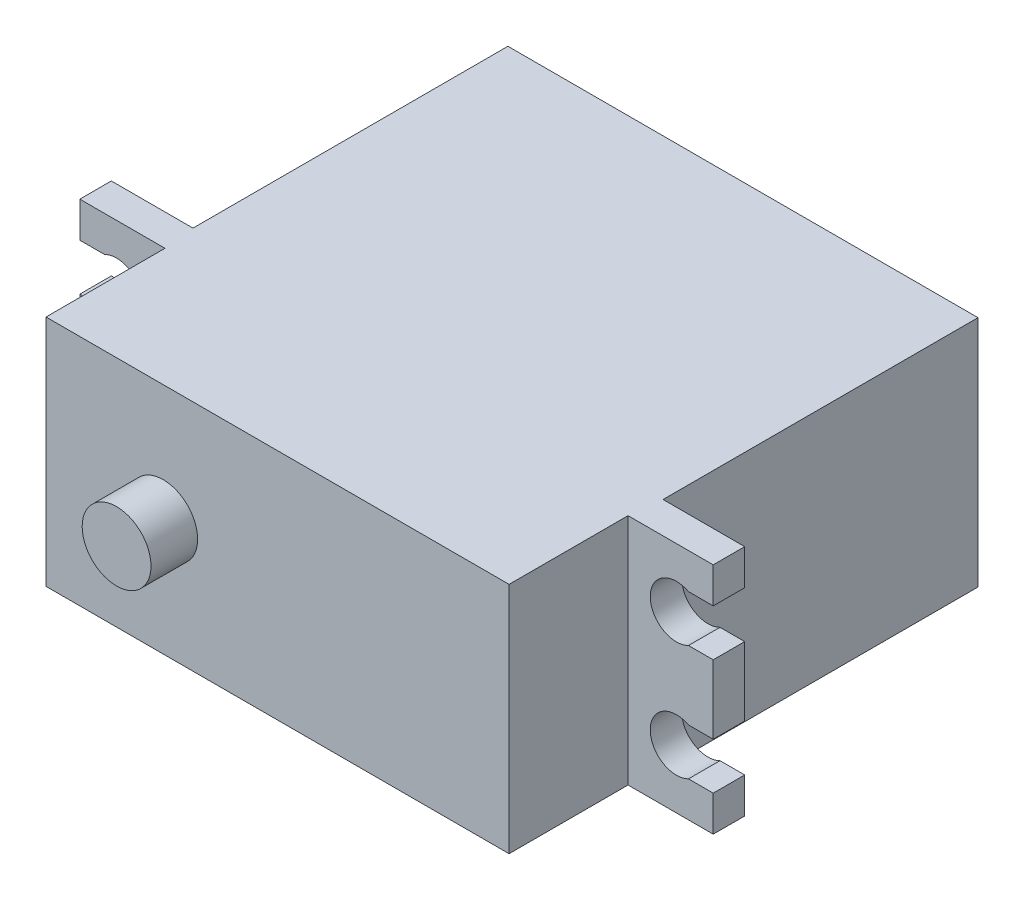
ISO-10303-21;
HEADER;
FILE_DESCRIPTION(('STEP AP214'),'2;1');
FILE_NAME('part.step','',(''),(''),'','','');
FILE_SCHEMA(('AUTOMOTIVE_DESIGN { 1 0 10303 214 1 1 1 1 }'));
ENDSEC;
DATA;
#1=APPLICATION_CONTEXT('core data for automotive mechanical design processes');
#2=APPLICATION_PROTOCOL_DEFINITION('international standard','automotive_design',2000,#1);
#3=PRODUCT_CONTEXT('',#1,'mechanical');
#4=PRODUCT('Part','Part','',(#3));
#5=PRODUCT_RELATED_PRODUCT_CATEGORY('part','',(#4));
#6=PRODUCT_DEFINITION_FORMATION('','',#4);
#7=PRODUCT_DEFINITION_CONTEXT('part definition',#1,'design');
#8=PRODUCT_DEFINITION('design','',#6,#7);
#9=PRODUCT_DEFINITION_SHAPE('','',#8);
#10=(LENGTH_UNIT() NAMED_UNIT(*) SI_UNIT(.MILLI.,.METRE.));
#11=(NAMED_UNIT(*) PLANE_ANGLE_UNIT() SI_UNIT($,.RADIAN.));
#12=(NAMED_UNIT(*) SI_UNIT($,.STERADIAN.) SOLID_ANGLE_UNIT());
#13=UNCERTAINTY_MEASURE_WITH_UNIT(LENGTH_MEASURE(1.E-05),#10,'distance_accuracy_value','');
#14=(GEOMETRIC_REPRESENTATION_CONTEXT(3) GLOBAL_UNCERTAINTY_ASSIGNED_CONTEXT((#13)) GLOBAL_UNIT_ASSIGNED_CONTEXT((#10,
#11,#12)) REPRESENTATION_CONTEXT('',''));
#15=CARTESIAN_POINT('',(0.,0.,0.));
#16=DIRECTION('',(0.,0.,1.));
#17=DIRECTION('',(1.,0.,0.));
#18=AXIS2_PLACEMENT_3D('',#15,#16,#17);
#19=CARTESIAN_POINT('',(-20.15,20.,13.5));
#20=DIRECTION('',(1.,0.,0.));
#21=DIRECTION('',(0.,0.,-1.));
#22=AXIS2_PLACEMENT_3D('',#19,#20,#21);
#23=PLANE('',#22);
#24=DIRECTION('',(0.,0.,1.));
#25=VECTOR('',#24,1.);
#26=CARTESIAN_POINT('',(-20.15,0.,13.5));
#27=LINE('',#26,#25);
#28=CARTESIAN_POINT('',(-20.15,0.,-13.5));
#29=VERTEX_POINT('',#28);
#30=CARTESIAN_POINT('',(-20.15,0.,13.5));
#31=VERTEX_POINT('',#30);
#32=EDGE_CURVE('E540',#29,#31,#27,.T.);
#33=ORIENTED_EDGE('',*,*,#32,.T.);
#34=DIRECTION('',(0.,-1.,0.));
#35=VECTOR('',#34,1.);
#36=CARTESIAN_POINT('',(-20.15,20.,13.5));
#37=LINE('',#36,#35);
#38=CARTESIAN_POINT('',(-20.15,20.,13.5));
#39=VERTEX_POINT('',#38);
#40=EDGE_CURVE('E52',#39,#31,#37,.T.);
#41=ORIENTED_EDGE('',*,*,#40,.F.);
#42=DIRECTION('',(0.,0.,1.));
#43=VECTOR('',#42,1.);
#44=CARTESIAN_POINT('',(-20.15,20.,13.5));
#45=LINE('',#44,#43);
#46=CARTESIAN_POINT('',(-20.15,20.,-13.5));
#47=VERTEX_POINT('',#46);
#48=EDGE_CURVE('E541',#47,#39,#45,.T.);
#49=ORIENTED_EDGE('',*,*,#48,.F.);
#50=DIRECTION('',(0.,-1.,0.));
#51=VECTOR('',#50,1.);
#52=CARTESIAN_POINT('',(-20.15,20.,-13.5));
#53=LINE('',#52,#51);
#54=EDGE_CURVE('E551',#47,#29,#53,.T.);
#55=ORIENTED_EDGE('',*,*,#54,.T.);
#56=EDGE_LOOP('',(#33,#41,#49,#55));
#57=FACE_BOUND('',#56,.T.);
#58=DIRECTION('',(0.,-1.,0.));
#59=VECTOR('',#58,1.);
#60=CARTESIAN_POINT('',(-20.15,4.31028668779854,-10.4184509071389));
#61=LINE('',#60,#59);
#62=CARTESIAN_POINT('',(-20.15,15.6897133122015,-10.4184509071389));
#63=VERTEX_POINT('',#62);
#64=CARTESIAN_POINT('',(-20.15,4.31028668779854,-10.4184509071389));
#65=VERTEX_POINT('',#64);
#66=EDGE_CURVE('E275',#63,#65,#61,.T.);
#67=ORIENTED_EDGE('',*,*,#66,.F.);
#68=DIRECTION('',(0.,0.,-1.));
#69=VECTOR('',#68,1.);
#70=CARTESIAN_POINT('',(-20.15,15.6897133122015,-6.91708886886109));
#71=LINE('',#70,#69);
#72=CARTESIAN_POINT('',(-20.15,15.6897133122015,-6.91708886886109));
#73=VERTEX_POINT('',#72);
#74=EDGE_CURVE('E272',#73,#63,#71,.T.);
#75=ORIENTED_EDGE('',*,*,#74,.F.);
#76=DIRECTION('',(0.,1.,0.));
#77=VECTOR('',#76,1.);
#78=CARTESIAN_POINT('',(-20.15,4.31028668779854,-6.91708886886109));
#79=LINE('',#78,#77);
#80=CARTESIAN_POINT('',(-20.15,4.31028668779854,-6.91708886886109));
#81=VERTEX_POINT('',#80);
#82=EDGE_CURVE('E64',#81,#73,#79,.T.);
#83=ORIENTED_EDGE('',*,*,#82,.F.);
#84=DIRECTION('',(0.,0.,1.));
#85=VECTOR('',#84,1.);
#86=CARTESIAN_POINT('',(-20.15,4.31028668779854,-6.91708886886109));
#87=LINE('',#86,#85);
#88=EDGE_CURVE('E59',#65,#81,#87,.T.);
#89=ORIENTED_EDGE('',*,*,#88,.F.);
#90=EDGE_LOOP('',(#67,#75,#83,#89));
#91=FACE_BOUND('',#90,.T.);
#92=ADVANCED_FACE('F44',(#57,#91),#23,.F.);
#93=CARTESIAN_POINT('',(0.,0.,16.2));
#94=DIRECTION('',(0.,0.,1.));
#95=DIRECTION('',(1.,0.,0.));
#96=AXIS2_PLACEMENT_3D('',#93,#94,#95);
#97=PLANE('',#96);
#98=DIRECTION('',(-1.,0.,0.));
#99=VECTOR('',#98,1.);
#100=CARTESIAN_POINT('',(0.,0.,16.2));
#101=LINE('',#100,#99);
#102=CARTESIAN_POINT('',(-19.85,0.,16.2));
#103=VERTEX_POINT('',#102);
#104=CARTESIAN_POINT('',(-27.15,0.,16.2));
#105=VERTEX_POINT('',#104);
#106=EDGE_CURVE('E334',#103,#105,#101,.T.);
#107=ORIENTED_EDGE('',*,*,#106,.F.);
#108=DIRECTION('',(0.,1.,0.));
#109=VECTOR('',#108,1.);
#110=CARTESIAN_POINT('',(-19.85,0.,16.2));
#111=LINE('',#110,#109);
#112=CARTESIAN_POINT('',(-19.85,20.,16.2));
#113=VERTEX_POINT('',#112);
#114=EDGE_CURVE('E282',#103,#113,#111,.T.);
#115=ORIENTED_EDGE('',*,*,#114,.T.);
#116=DIRECTION('',(-1.,0.,0.));
#117=VECTOR('',#116,1.);
#118=CARTESIAN_POINT('',(0.,20.,16.2));
#119=LINE('',#118,#117);
#120=CARTESIAN_POINT('',(-27.15,20.,16.2));
#121=VERTEX_POINT('',#120);
#122=EDGE_CURVE('E370',#113,#121,#119,.T.);
#123=ORIENTED_EDGE('',*,*,#122,.T.);
#124=DIRECTION('',(0.,1.,0.));
#125=VECTOR('',#124,1.);
#126=CARTESIAN_POINT('',(-27.15,0.,16.2));
#127=LINE('',#126,#125);
#128=CARTESIAN_POINT('',(-27.15,16.95,16.2));
#129=VERTEX_POINT('',#128);
#130=EDGE_CURVE('E375',#129,#121,#127,.T.);
#131=ORIENTED_EDGE('',*,*,#130,.F.);
#132=DIRECTION('',(-1.,0.,0.));
#133=VECTOR('',#132,1.);
#134=CARTESIAN_POINT('',(0.,16.95,16.2));
#135=LINE('',#134,#133);
#136=CARTESIAN_POINT('',(-25.0307764064044,16.95,16.2));
#137=VERTEX_POINT('',#136);
#138=EDGE_CURVE('E379',#137,#129,#135,.T.);
#139=ORIENTED_EDGE('',*,*,#138,.F.);
#140=CARTESIAN_POINT('',(-24.,14.95,16.2));
#141=DIRECTION('',(0.,0.,1.));
#142=DIRECTION('',(1.,0.,0.));
#143=AXIS2_PLACEMENT_3D('',#140,#141,#142);
#144=CIRCLE('',#143,2.25);
#145=CARTESIAN_POINT('',(-25.0307764064044,12.95,16.2));
#146=VERTEX_POINT('',#145);
#147=EDGE_CURVE('E383',#146,#137,#144,.T.);
#148=ORIENTED_EDGE('',*,*,#147,.F.);
#149=DIRECTION('',(-1.,0.,0.));
#150=VECTOR('',#149,1.);
#151=CARTESIAN_POINT('',(0.,12.95,16.2));
#152=LINE('',#151,#150);
#153=CARTESIAN_POINT('',(-27.15,12.95,16.2));
#154=VERTEX_POINT('',#153);
#155=EDGE_CURVE('E387',#146,#154,#152,.T.);
#156=ORIENTED_EDGE('',*,*,#155,.T.);
#157=DIRECTION('',(0.,1.,0.));
#158=VECTOR('',#157,1.);
#159=CARTESIAN_POINT('',(-27.15,0.,16.2));
#160=LINE('',#159,#158);
#161=CARTESIAN_POINT('',(-27.15,7.05,16.2));
#162=VERTEX_POINT('',#161);
#163=EDGE_CURVE('E390',#162,#154,#160,.T.);
#164=ORIENTED_EDGE('',*,*,#163,.F.);
#165=DIRECTION('',(-1.,0.,0.));
#166=VECTOR('',#165,1.);
#167=CARTESIAN_POINT('',(0.,7.05,16.2));
#168=LINE('',#167,#166);
#169=CARTESIAN_POINT('',(-25.0307764064044,7.05,16.2));
#170=VERTEX_POINT('',#169);
#171=EDGE_CURVE('E394',#170,#162,#168,.T.);
#172=ORIENTED_EDGE('',*,*,#171,.F.);
#173=CARTESIAN_POINT('',(-24.,5.05,16.2));
#174=DIRECTION('',(0.,0.,1.));
#175=DIRECTION('',(1.,0.,0.));
#176=AXIS2_PLACEMENT_3D('',#173,#174,#175);
#177=CIRCLE('',#176,2.25);
#178=CARTESIAN_POINT('',(-25.0307764064044,3.05,16.2));
#179=VERTEX_POINT('',#178);
#180=EDGE_CURVE('E322',#179,#170,#177,.T.);
#181=ORIENTED_EDGE('',*,*,#180,.F.);
#182=DIRECTION('',(-1.,0.,0.));
#183=VECTOR('',#182,1.);
#184=CARTESIAN_POINT('',(0.,3.05,16.2));
#185=LINE('',#184,#183);
#186=CARTESIAN_POINT('',(-27.15,3.05,16.2));
#187=VERTEX_POINT('',#186);
#188=EDGE_CURVE('E326',#179,#187,#185,.T.);
#189=ORIENTED_EDGE('',*,*,#188,.T.);
#190=DIRECTION('',(0.,1.,0.));
#191=VECTOR('',#190,1.);
#192=CARTESIAN_POINT('',(-27.15,0.,16.2));
#193=LINE('',#192,#191);
#194=EDGE_CURVE('E330',#105,#187,#193,.T.);
#195=ORIENTED_EDGE('',*,*,#194,.F.);
#196=EDGE_LOOP('',(#107,#115,#123,#131,#139,#148,#156,#164,#172,#181,#189,#195));
#197=FACE_BOUND('',#196,.T.);
#198=ADVANCED_FACE('F592',(#197),#97,.T.);
#199=CARTESIAN_POINT('',(20.15,20.,13.5));
#200=DIRECTION('',(-1.,0.,0.));
#201=DIRECTION('',(0.,0.,1.));
#202=AXIS2_PLACEMENT_3D('',#199,#200,#201);
#203=PLANE('',#202);
#204=DIRECTION('',(0.,0.,-1.));
#205=VECTOR('',#204,1.);
#206=CARTESIAN_POINT('',(20.15,0.,13.5));
#207=LINE('',#206,#205);
#208=CARTESIAN_POINT('',(20.15,0.,13.5));
#209=VERTEX_POINT('',#208);
#210=CARTESIAN_POINT('',(20.15,0.,-13.5));
#211=VERTEX_POINT('',#210);
#212=EDGE_CURVE('E554',#209,#211,#207,.T.);
#213=ORIENTED_EDGE('',*,*,#212,.T.);
#214=DIRECTION('',(0.,-1.,0.));
#215=VECTOR('',#214,1.);
#216=CARTESIAN_POINT('',(20.15,20.,-13.5));
#217=LINE('',#216,#215);
#218=CARTESIAN_POINT('',(20.15,20.,-13.5));
#219=VERTEX_POINT('',#218);
#220=EDGE_CURVE('E562',#219,#211,#217,.T.);
#221=ORIENTED_EDGE('',*,*,#220,.F.);
#222=DIRECTION('',(0.,0.,-1.));
#223=VECTOR('',#222,1.);
#224=CARTESIAN_POINT('',(20.15,20.,13.5));
#225=LINE('',#224,#223);
#226=CARTESIAN_POINT('',(20.15,20.,13.5));
#227=VERTEX_POINT('',#226);
#228=EDGE_CURVE('E544',#227,#219,#225,.T.);
#229=ORIENTED_EDGE('',*,*,#228,.F.);
#230=DIRECTION('',(0.,-1.,0.));
#231=VECTOR('',#230,1.);
#232=CARTESIAN_POINT('',(20.15,20.,13.5));
#233=LINE('',#232,#231);
#234=EDGE_CURVE('E566',#227,#209,#233,.T.);
#235=ORIENTED_EDGE('',*,*,#234,.T.);
#236=EDGE_LOOP('',(#213,#221,#229,#235));
#237=FACE_BOUND('',#236,.T.);
#238=ADVANCED_FACE('F646',(#237),#203,.F.);
#239=CARTESIAN_POINT('',(20.15,20.,-13.5));
#240=DIRECTION('',(0.,0.,1.));
#241=DIRECTION('',(1.,0.,0.));
#242=AXIS2_PLACEMENT_3D('',#239,#240,#241);
#243=PLANE('',#242);
#244=DIRECTION('',(-1.,0.,0.));
#245=VECTOR('',#244,1.);
#246=CARTESIAN_POINT('',(20.15,0.,-13.5));
#247=LINE('',#246,#245);
#248=EDGE_CURVE('E545',#211,#29,#247,.T.);
#249=ORIENTED_EDGE('',*,*,#248,.T.);
#250=ORIENTED_EDGE('',*,*,#54,.F.);
#251=DIRECTION('',(-1.,0.,0.));
#252=VECTOR('',#251,1.);
#253=CARTESIAN_POINT('',(20.15,20.,-13.5));
#254=LINE('',#253,#252);
#255=EDGE_CURVE('E548',#219,#47,#254,.T.);
#256=ORIENTED_EDGE('',*,*,#255,.F.);
#257=ORIENTED_EDGE('',*,*,#220,.T.);
#258=EDGE_LOOP('',(#249,#250,#256,#257));
#259=FACE_BOUND('',#258,.T.);
#260=ADVANCED_FACE('F721',(#259),#243,.F.);
#261=CARTESIAN_POINT('',(0.,20.,0.));
#262=DIRECTION('',(0.,1.,0.));
#263=DIRECTION('',(0.,0.,1.));
#264=AXIS2_PLACEMENT_3D('',#261,#262,#263);
#265=PLANE('',#264);
#266=ORIENTED_EDGE('',*,*,#48,.T.);
#267=DIRECTION('',(-1.,0.,0.));
#268=VECTOR('',#267,1.);
#269=CARTESIAN_POINT('',(0.,20.,13.5));
#270=LINE('',#269,#268);
#271=CARTESIAN_POINT('',(-27.15,20.,13.5));
#272=VERTEX_POINT('',#271);
#273=EDGE_CURVE('E448',#39,#272,#270,.T.);
#274=ORIENTED_EDGE('',*,*,#273,.T.);
#275=DIRECTION('',(0.,0.,-1.));
#276=VECTOR('',#275,1.);
#277=CARTESIAN_POINT('',(-27.15,20.,16.2));
#278=LINE('',#277,#276);
#279=EDGE_CURVE('E493',#121,#272,#278,.T.);
#280=ORIENTED_EDGE('',*,*,#279,.F.);
#281=ORIENTED_EDGE('',*,*,#122,.F.);
#282=DIRECTION('',(0.,0.,-1.));
#283=VECTOR('',#282,1.);
#284=CARTESIAN_POINT('',(-19.85,20.,26.4));
#285=LINE('',#284,#283);
#286=CARTESIAN_POINT('',(-19.85,20.,26.4));
#287=VERTEX_POINT('',#286);
#288=EDGE_CURVE('E318',#287,#113,#285,.T.);
#289=ORIENTED_EDGE('',*,*,#288,.F.);
#290=DIRECTION('',(-1.,0.,0.));
#291=VECTOR('',#290,1.);
#292=CARTESIAN_POINT('',(19.85,20.,26.4));
#293=LINE('',#292,#291);
#294=CARTESIAN_POINT('',(19.85,20.,26.4));
#295=VERTEX_POINT('',#294);
#296=EDGE_CURVE('E288',#295,#287,#293,.T.);
#297=ORIENTED_EDGE('',*,*,#296,.F.);
#298=DIRECTION('',(0.,0.,-1.));
#299=VECTOR('',#298,1.);
#300=CARTESIAN_POINT('',(19.85,20.,26.4));
#301=LINE('',#300,#299);
#302=CARTESIAN_POINT('',(19.85,20.,16.2));
#303=VERTEX_POINT('',#302);
#304=EDGE_CURVE('E303',#295,#303,#301,.T.);
#305=ORIENTED_EDGE('',*,*,#304,.T.);
#306=CARTESIAN_POINT('',(27.15,20.,16.2));
#307=VERTEX_POINT('',#306);
#308=EDGE_CURVE('E371',#307,#303,#119,.T.);
#309=ORIENTED_EDGE('',*,*,#308,.F.);
#310=DIRECTION('',(0.,0.,-1.));
#311=VECTOR('',#310,1.);
#312=CARTESIAN_POINT('',(27.15,20.,16.2));
#313=LINE('',#312,#311);
#314=CARTESIAN_POINT('',(27.15,20.,13.5));
#315=VERTEX_POINT('',#314);
#316=EDGE_CURVE('E497',#307,#315,#313,.T.);
#317=ORIENTED_EDGE('',*,*,#316,.T.);
#318=EDGE_CURVE('E449',#315,#227,#270,.T.);
#319=ORIENTED_EDGE('',*,*,#318,.T.);
#320=ORIENTED_EDGE('',*,*,#228,.T.);
#321=ORIENTED_EDGE('',*,*,#255,.T.);
#322=EDGE_LOOP('',(#266,#274,#280,#281,#289,#297,#305,#309,#317,#319,#320,#321));
#323=FACE_BOUND('',#322,.T.);
#324=ADVANCED_FACE('F597',(#323),#265,.T.);
#325=CARTESIAN_POINT('',(0.,0.,0.));
#326=DIRECTION('',(0.,1.,0.));
#327=DIRECTION('',(0.,0.,1.));
#328=AXIS2_PLACEMENT_3D('',#325,#326,#327);
#329=PLANE('',#328);
#330=ORIENTED_EDGE('',*,*,#32,.F.);
#331=ORIENTED_EDGE('',*,*,#248,.F.);
#332=ORIENTED_EDGE('',*,*,#212,.F.);
#333=DIRECTION('',(-1.,0.,0.));
#334=VECTOR('',#333,1.);
#335=CARTESIAN_POINT('',(0.,0.,13.5));
#336=LINE('',#335,#334);
#337=CARTESIAN_POINT('',(27.15,0.,13.5));
#338=VERTEX_POINT('',#337);
#339=EDGE_CURVE('E411',#338,#209,#336,.T.);
#340=ORIENTED_EDGE('',*,*,#339,.F.);
#341=DIRECTION('',(0.,0.,-1.));
#342=VECTOR('',#341,1.);
#343=CARTESIAN_POINT('',(27.15,0.,16.2));
#344=LINE('',#343,#342);
#345=CARTESIAN_POINT('',(27.15,0.,16.2));
#346=VERTEX_POINT('',#345);
#347=EDGE_CURVE('E527',#346,#338,#344,.T.);
#348=ORIENTED_EDGE('',*,*,#347,.F.);
#349=CARTESIAN_POINT('',(19.85,0.,16.2));
#350=VERTEX_POINT('',#349);
#351=EDGE_CURVE('E335',#346,#350,#101,.T.);
#352=ORIENTED_EDGE('',*,*,#351,.T.);
#353=DIRECTION('',(0.,0.,-1.));
#354=VECTOR('',#353,1.);
#355=CARTESIAN_POINT('',(19.85,0.,26.4));
#356=LINE('',#355,#354);
#357=CARTESIAN_POINT('',(19.85,0.,26.4));
#358=VERTEX_POINT('',#357);
#359=EDGE_CURVE('E312',#358,#350,#356,.T.);
#360=ORIENTED_EDGE('',*,*,#359,.F.);
#361=DIRECTION('',(-1.,0.,0.));
#362=VECTOR('',#361,1.);
#363=CARTESIAN_POINT('',(19.85,0.,26.4));
#364=LINE('',#363,#362);
#365=CARTESIAN_POINT('',(-19.85,0.,26.4));
#366=VERTEX_POINT('',#365);
#367=EDGE_CURVE('E296',#358,#366,#364,.T.);
#368=ORIENTED_EDGE('',*,*,#367,.T.);
#369=DIRECTION('',(0.,0.,-1.));
#370=VECTOR('',#369,1.);
#371=CARTESIAN_POINT('',(-19.85,0.,26.4));
#372=LINE('',#371,#370);
#373=EDGE_CURVE('E315',#366,#103,#372,.T.);
#374=ORIENTED_EDGE('',*,*,#373,.T.);
#375=ORIENTED_EDGE('',*,*,#106,.T.);
#376=DIRECTION('',(0.,0.,-1.));
#377=VECTOR('',#376,1.);
#378=CARTESIAN_POINT('',(-27.15,0.,16.2));
#379=LINE('',#378,#377);
#380=CARTESIAN_POINT('',(-27.15,0.,13.5));
#381=VERTEX_POINT('',#380);
#382=EDGE_CURVE('E530',#105,#381,#379,.T.);
#383=ORIENTED_EDGE('',*,*,#382,.T.);
#384=EDGE_CURVE('E410',#31,#381,#336,.T.);
#385=ORIENTED_EDGE('',*,*,#384,.F.);
#386=EDGE_LOOP('',(#330,#331,#332,#340,#348,#352,#360,#368,#374,#375,#383,#385));
#387=FACE_BOUND('',#386,.T.);
#388=ADVANCED_FACE('F579',(#387),#329,.F.);
#389=CARTESIAN_POINT('',(0.,0.,13.5));
#390=DIRECTION('',(0.,0.,1.));
#391=DIRECTION('',(1.,0.,0.));
#392=AXIS2_PLACEMENT_3D('',#389,#390,#391);
#393=PLANE('',#392);
#394=ORIENTED_EDGE('',*,*,#273,.F.);
#395=ORIENTED_EDGE('',*,*,#40,.T.);
#396=ORIENTED_EDGE('',*,*,#384,.T.);
#397=DIRECTION('',(0.,1.,0.));
#398=VECTOR('',#397,1.);
#399=CARTESIAN_POINT('',(-27.15,0.,13.5));
#400=LINE('',#399,#398);
#401=CARTESIAN_POINT('',(-27.15,3.05,13.5));
#402=VERTEX_POINT('',#401);
#403=EDGE_CURVE('E406',#381,#402,#400,.T.);
#404=ORIENTED_EDGE('',*,*,#403,.T.);
#405=DIRECTION('',(-1.,0.,0.));
#406=VECTOR('',#405,1.);
#407=CARTESIAN_POINT('',(0.,3.05,13.5));
#408=LINE('',#407,#406);
#409=CARTESIAN_POINT('',(-25.0307764064044,3.05,13.5));
#410=VERTEX_POINT('',#409);
#411=EDGE_CURVE('E402',#410,#402,#408,.T.);
#412=ORIENTED_EDGE('',*,*,#411,.F.);
#413=CARTESIAN_POINT('',(-24.,5.05,13.5));
#414=DIRECTION('',(0.,0.,1.));
#415=DIRECTION('',(1.,0.,0.));
#416=AXIS2_PLACEMENT_3D('',#413,#414,#415);
#417=CIRCLE('',#416,2.25);
#418=CARTESIAN_POINT('',(-25.0307764064044,7.05,13.5));
#419=VERTEX_POINT('',#418);
#420=EDGE_CURVE('E321',#410,#419,#417,.T.);
#421=ORIENTED_EDGE('',*,*,#420,.T.);
#422=DIRECTION('',(-1.,0.,0.));
#423=VECTOR('',#422,1.);
#424=CARTESIAN_POINT('',(0.,7.05,13.5));
#425=LINE('',#424,#423);
#426=CARTESIAN_POINT('',(-27.15,7.05,13.5));
#427=VERTEX_POINT('',#426);
#428=EDGE_CURVE('E327',#419,#427,#425,.T.);
#429=ORIENTED_EDGE('',*,*,#428,.T.);
#430=DIRECTION('',(0.,1.,0.));
#431=VECTOR('',#430,1.);
#432=CARTESIAN_POINT('',(-27.15,0.,13.5));
#433=LINE('',#432,#431);
#434=CARTESIAN_POINT('',(-27.15,12.95,13.5));
#435=VERTEX_POINT('',#434);
#436=EDGE_CURVE('E469',#427,#435,#433,.T.);
#437=ORIENTED_EDGE('',*,*,#436,.T.);
#438=DIRECTION('',(-1.,0.,0.));
#439=VECTOR('',#438,1.);
#440=CARTESIAN_POINT('',(0.,12.95,13.5));
#441=LINE('',#440,#439);
#442=CARTESIAN_POINT('',(-25.0307764064044,12.95,13.5));
#443=VERTEX_POINT('',#442);
#444=EDGE_CURVE('E465',#443,#435,#441,.T.);
#445=ORIENTED_EDGE('',*,*,#444,.F.);
#446=CARTESIAN_POINT('',(-24.,14.95,13.5));
#447=DIRECTION('',(0.,0.,1.));
#448=DIRECTION('',(1.,0.,0.));
#449=AXIS2_PLACEMENT_3D('',#446,#447,#448);
#450=CIRCLE('',#449,2.25);
#451=CARTESIAN_POINT('',(-25.0307764064044,16.95,13.5));
#452=VERTEX_POINT('',#451);
#453=EDGE_CURVE('E461',#443,#452,#450,.T.);
#454=ORIENTED_EDGE('',*,*,#453,.T.);
#455=DIRECTION('',(-1.,0.,0.));
#456=VECTOR('',#455,1.);
#457=CARTESIAN_POINT('',(0.,16.95,13.5));
#458=LINE('',#457,#456);
#459=CARTESIAN_POINT('',(-27.15,16.95,13.5));
#460=VERTEX_POINT('',#459);
#461=EDGE_CURVE('E457',#452,#460,#458,.T.);
#462=ORIENTED_EDGE('',*,*,#461,.T.);
#463=DIRECTION('',(0.,1.,0.));
#464=VECTOR('',#463,1.);
#465=CARTESIAN_POINT('',(-27.15,0.,13.5));
#466=LINE('',#465,#464);
#467=EDGE_CURVE('E453',#460,#272,#466,.T.);
#468=ORIENTED_EDGE('',*,*,#467,.T.);
#469=EDGE_LOOP('',(#394,#395,#396,#404,#412,#421,#429,#437,#445,#454,#462,#468));
#470=FACE_BOUND('',#469,.T.);
#471=ADVANCED_FACE('F574',(#470),#393,.F.);
#472=CARTESIAN_POINT('',(-24.,5.05,16.2));
#473=DIRECTION('',(0.,0.,-1.));
#474=DIRECTION('',(-1.,0.,0.));
#475=AXIS2_PLACEMENT_3D('',#472,#473,#474);
#476=CYLINDRICAL_SURFACE('',#475,2.25);
#477=ORIENTED_EDGE('',*,*,#420,.F.);
#478=DIRECTION('',(0.,0.,-1.));
#479=VECTOR('',#478,1.);
#480=CARTESIAN_POINT('',(-25.0307764064044,3.05,16.2));
#481=LINE('',#480,#479);
#482=EDGE_CURVE('E537',#179,#410,#481,.T.);
#483=ORIENTED_EDGE('',*,*,#482,.F.);
#484=ORIENTED_EDGE('',*,*,#180,.T.);
#485=DIRECTION('',(0.,0.,-1.));
#486=VECTOR('',#485,1.);
#487=CARTESIAN_POINT('',(-25.0307764064044,7.05,16.2));
#488=LINE('',#487,#486);
#489=EDGE_CURVE('E398',#170,#419,#488,.T.);
#490=ORIENTED_EDGE('',*,*,#489,.T.);
#491=EDGE_LOOP('',(#477,#483,#484,#490));
#492=FACE_BOUND('',#491,.T.);
#493=ADVANCED_FACE('F623',(#492),#476,.F.);
#494=CARTESIAN_POINT('',(0.,3.05,16.2));
#495=DIRECTION('',(0.,-1.,0.));
#496=DIRECTION('',(1.,0.,0.));
#497=AXIS2_PLACEMENT_3D('',#494,#495,#496);
#498=PLANE('',#497);
#499=ORIENTED_EDGE('',*,*,#411,.T.);
#500=DIRECTION('',(0.,0.,-1.));
#501=VECTOR('',#500,1.);
#502=CARTESIAN_POINT('',(-27.15,3.05,16.2));
#503=LINE('',#502,#501);
#504=EDGE_CURVE('E534',#187,#402,#503,.T.);
#505=ORIENTED_EDGE('',*,*,#504,.F.);
#506=ORIENTED_EDGE('',*,*,#188,.F.);
#507=ORIENTED_EDGE('',*,*,#482,.T.);
#508=EDGE_LOOP('',(#499,#505,#506,#507));
#509=FACE_BOUND('',#508,.T.);
#510=ADVANCED_FACE('F628',(#509),#498,.F.);
#511=CARTESIAN_POINT('',(-27.15,0.,16.2));
#512=DIRECTION('',(-1.,0.,0.));
#513=DIRECTION('',(0.,0.,1.));
#514=AXIS2_PLACEMENT_3D('',#511,#512,#513);
#515=PLANE('',#514);
#516=ORIENTED_EDGE('',*,*,#403,.F.);
#517=ORIENTED_EDGE('',*,*,#382,.F.);
#518=ORIENTED_EDGE('',*,*,#194,.T.);
#519=ORIENTED_EDGE('',*,*,#504,.T.);
#520=EDGE_LOOP('',(#516,#517,#518,#519));
#521=FACE_BOUND('',#520,.T.);
#522=ADVANCED_FACE('F631',(#521),#515,.T.);
#523=CARTESIAN_POINT('',(27.15,0.,16.2));
#524=DIRECTION('',(-1.,0.,0.));
#525=DIRECTION('',(0.,0.,1.));
#526=AXIS2_PLACEMENT_3D('',#523,#524,#525);
#527=PLANE('',#526);
#528=DIRECTION('',(0.,1.,0.));
#529=VECTOR('',#528,1.);
#530=CARTESIAN_POINT('',(27.15,0.,13.5));
#531=LINE('',#530,#529);
#532=CARTESIAN_POINT('',(27.15,3.05000000000001,13.5));
#533=VERTEX_POINT('',#532);
#534=EDGE_CURVE('E415',#338,#533,#531,.T.);
#535=ORIENTED_EDGE('',*,*,#534,.T.);
#536=DIRECTION('',(0.,0.,-1.));
#537=VECTOR('',#536,1.);
#538=CARTESIAN_POINT('',(27.15,3.05000000000001,16.2));
#539=LINE('',#538,#537);
#540=CARTESIAN_POINT('',(27.15,3.05000000000001,16.2));
#541=VERTEX_POINT('',#540);
#542=EDGE_CURVE('E524',#541,#533,#539,.T.);
#543=ORIENTED_EDGE('',*,*,#542,.F.);
#544=DIRECTION('',(0.,1.,0.));
#545=VECTOR('',#544,1.);
#546=CARTESIAN_POINT('',(27.15,0.,16.2));
#547=LINE('',#546,#545);
#548=EDGE_CURVE('E339',#346,#541,#547,.T.);
#549=ORIENTED_EDGE('',*,*,#548,.F.);
#550=ORIENTED_EDGE('',*,*,#347,.T.);
#551=EDGE_LOOP('',(#535,#543,#549,#550));
#552=FACE_BOUND('',#551,.T.);
#553=ADVANCED_FACE('F742',(#552),#527,.F.);
#554=CARTESIAN_POINT('',(0.,3.05000000000001,16.2));
#555=DIRECTION('',(0.,1.,0.));
#556=DIRECTION('',(0.,0.,1.));
#557=AXIS2_PLACEMENT_3D('',#554,#555,#556);
#558=PLANE('',#557);
#559=DIRECTION('',(1.,0.,0.));
#560=VECTOR('',#559,1.);
#561=CARTESIAN_POINT('',(0.,3.05000000000001,13.5));
#562=LINE('',#561,#560);
#563=CARTESIAN_POINT('',(25.0307764064044,3.05000000000001,13.5));
#564=VERTEX_POINT('',#563);
#565=EDGE_CURVE('E419',#564,#533,#562,.T.);
#566=ORIENTED_EDGE('',*,*,#565,.F.);
#567=DIRECTION('',(0.,0.,-1.));
#568=VECTOR('',#567,1.);
#569=CARTESIAN_POINT('',(25.0307764064044,3.05000000000001,16.2));
#570=LINE('',#569,#568);
#571=CARTESIAN_POINT('',(25.0307764064044,3.05000000000001,16.2));
#572=VERTEX_POINT('',#571);
#573=EDGE_CURVE('E521',#572,#564,#570,.T.);
#574=ORIENTED_EDGE('',*,*,#573,.F.);
#575=DIRECTION('',(1.,0.,0.));
#576=VECTOR('',#575,1.);
#577=CARTESIAN_POINT('',(0.,3.05000000000001,16.2));
#578=LINE('',#577,#576);
#579=EDGE_CURVE('E342',#572,#541,#578,.T.);
#580=ORIENTED_EDGE('',*,*,#579,.T.);
#581=ORIENTED_EDGE('',*,*,#542,.T.);
#582=EDGE_LOOP('',(#566,#574,#580,#581));
#583=FACE_BOUND('',#582,.T.);
#584=ADVANCED_FACE('F784',(#583),#558,.T.);
#585=CARTESIAN_POINT('',(24.,5.05,16.2));
#586=DIRECTION('',(0.,0.,-1.));
#587=DIRECTION('',(-1.,0.,0.));
#588=AXIS2_PLACEMENT_3D('',#585,#586,#587);
#589=CYLINDRICAL_SURFACE('',#588,2.25);
#590=CARTESIAN_POINT('',(24.,5.05,13.5));
#591=DIRECTION('',(0.,0.,1.));
#592=DIRECTION('',(1.,0.,0.));
#593=AXIS2_PLACEMENT_3D('',#590,#591,#592);
#594=CIRCLE('',#593,2.25);
#595=CARTESIAN_POINT('',(25.0307764064044,7.05,13.5));
#596=VERTEX_POINT('',#595);
#597=EDGE_CURVE('E423',#596,#564,#594,.T.);
#598=ORIENTED_EDGE('',*,*,#597,.F.);
#599=DIRECTION('',(0.,0.,-1.));
#600=VECTOR('',#599,1.);
#601=CARTESIAN_POINT('',(25.0307764064044,7.05,16.2));
#602=LINE('',#601,#600);
#603=CARTESIAN_POINT('',(25.0307764064044,7.05,16.2));
#604=VERTEX_POINT('',#603);
#605=EDGE_CURVE('E518',#604,#596,#602,.T.);
#606=ORIENTED_EDGE('',*,*,#605,.F.);
#607=CARTESIAN_POINT('',(24.,5.05,16.2));
#608=DIRECTION('',(0.,0.,1.));
#609=DIRECTION('',(1.,0.,0.));
#610=AXIS2_PLACEMENT_3D('',#607,#608,#609);
#611=CIRCLE('',#610,2.25);
#612=EDGE_CURVE('E346',#604,#572,#611,.T.);
#613=ORIENTED_EDGE('',*,*,#612,.T.);
#614=ORIENTED_EDGE('',*,*,#573,.T.);
#615=EDGE_LOOP('',(#598,#606,#613,#614));
#616=FACE_BOUND('',#615,.T.);
#617=ADVANCED_FACE('F781',(#616),#589,.F.);
#618=CARTESIAN_POINT('',(0.,7.05,16.2));
#619=DIRECTION('',(0.,1.,0.));
#620=DIRECTION('',(0.,0.,1.));
#621=AXIS2_PLACEMENT_3D('',#618,#619,#620);
#622=PLANE('',#621);
#623=DIRECTION('',(1.,0.,0.));
#624=VECTOR('',#623,1.);
#625=CARTESIAN_POINT('',(0.,7.05,13.5));
#626=LINE('',#625,#624);
#627=CARTESIAN_POINT('',(27.15,7.05,13.5));
#628=VERTEX_POINT('',#627);
#629=EDGE_CURVE('E427',#596,#628,#626,.T.);
#630=ORIENTED_EDGE('',*,*,#629,.T.);
#631=DIRECTION('',(0.,0.,-1.));
#632=VECTOR('',#631,1.);
#633=CARTESIAN_POINT('',(27.15,7.05,16.2));
#634=LINE('',#633,#632);
#635=CARTESIAN_POINT('',(27.15,7.05,16.2));
#636=VERTEX_POINT('',#635);
#637=EDGE_CURVE('E514',#636,#628,#634,.T.);
#638=ORIENTED_EDGE('',*,*,#637,.F.);
#639=DIRECTION('',(1.,0.,0.));
#640=VECTOR('',#639,1.);
#641=CARTESIAN_POINT('',(0.,7.05,16.2));
#642=LINE('',#641,#640);
#643=EDGE_CURVE('E350',#604,#636,#642,.T.);
#644=ORIENTED_EDGE('',*,*,#643,.F.);
#645=ORIENTED_EDGE('',*,*,#605,.T.);
#646=EDGE_LOOP('',(#630,#638,#644,#645));
#647=FACE_BOUND('',#646,.T.);
#648=ADVANCED_FACE('F778',(#647),#622,.F.);
#649=CARTESIAN_POINT('',(27.15,0.,16.2));
#650=DIRECTION('',(-1.,0.,0.));
#651=DIRECTION('',(0.,0.,1.));
#652=AXIS2_PLACEMENT_3D('',#649,#650,#651);
#653=PLANE('',#652);
#654=DIRECTION('',(0.,1.,0.));
#655=VECTOR('',#654,1.);
#656=CARTESIAN_POINT('',(27.15,0.,13.5));
#657=LINE('',#656,#655);
#658=CARTESIAN_POINT('',(27.15,12.95,13.5));
#659=VERTEX_POINT('',#658);
#660=EDGE_CURVE('E430',#628,#659,#657,.T.);
#661=ORIENTED_EDGE('',*,*,#660,.T.);
#662=DIRECTION('',(0.,0.,-1.));
#663=VECTOR('',#662,1.);
#664=CARTESIAN_POINT('',(27.15,12.95,16.2));
#665=LINE('',#664,#663);
#666=CARTESIAN_POINT('',(27.15,12.95,16.2));
#667=VERTEX_POINT('',#666);
#668=EDGE_CURVE('E511',#667,#659,#665,.T.);
#669=ORIENTED_EDGE('',*,*,#668,.F.);
#670=DIRECTION('',(0.,1.,0.));
#671=VECTOR('',#670,1.);
#672=CARTESIAN_POINT('',(27.15,0.,16.2));
#673=LINE('',#672,#671);
#674=EDGE_CURVE('E353',#636,#667,#673,.T.);
#675=ORIENTED_EDGE('',*,*,#674,.F.);
#676=ORIENTED_EDGE('',*,*,#637,.T.);
#677=EDGE_LOOP('',(#661,#669,#675,#676));
#678=FACE_BOUND('',#677,.T.);
#679=ADVANCED_FACE('F773',(#678),#653,.F.);
#680=CARTESIAN_POINT('',(0.,12.95,16.2));
#681=DIRECTION('',(0.,1.,0.));
#682=DIRECTION('',(0.,0.,1.));
#683=AXIS2_PLACEMENT_3D('',#680,#681,#682);
#684=PLANE('',#683);
#685=DIRECTION('',(1.,0.,0.));
#686=VECTOR('',#685,1.);
#687=CARTESIAN_POINT('',(0.,12.95,13.5));
#688=LINE('',#687,#686);
#689=CARTESIAN_POINT('',(25.0307764064044,12.95,13.5));
#690=VERTEX_POINT('',#689);
#691=EDGE_CURVE('E434',#690,#659,#688,.T.);
#692=ORIENTED_EDGE('',*,*,#691,.F.);
#693=DIRECTION('',(0.,0.,-1.));
#694=VECTOR('',#693,1.);
#695=CARTESIAN_POINT('',(25.0307764064044,12.95,16.2));
#696=LINE('',#695,#694);
#697=CARTESIAN_POINT('',(25.0307764064044,12.95,16.2));
#698=VERTEX_POINT('',#697);
#699=EDGE_CURVE('E508',#698,#690,#696,.T.);
#700=ORIENTED_EDGE('',*,*,#699,.F.);
#701=DIRECTION('',(1.,0.,0.));
#702=VECTOR('',#701,1.);
#703=CARTESIAN_POINT('',(0.,12.95,16.2));
#704=LINE('',#703,#702);
#705=EDGE_CURVE('E356',#698,#667,#704,.T.);
#706=ORIENTED_EDGE('',*,*,#705,.T.);
#707=ORIENTED_EDGE('',*,*,#668,.T.);
#708=EDGE_LOOP('',(#692,#700,#706,#707));
#709=FACE_BOUND('',#708,.T.);
#710=ADVANCED_FACE('F767',(#709),#684,.T.);
#711=CARTESIAN_POINT('',(24.,14.95,16.2));
#712=DIRECTION('',(0.,0.,-1.));
#713=DIRECTION('',(-1.,0.,0.));
#714=AXIS2_PLACEMENT_3D('',#711,#712,#713);
#715=CYLINDRICAL_SURFACE('',#714,2.25);
#716=CARTESIAN_POINT('',(24.,14.95,13.5));
#717=DIRECTION('',(0.,0.,1.));
#718=DIRECTION('',(1.,0.,0.));
#719=AXIS2_PLACEMENT_3D('',#716,#717,#718);
#720=CIRCLE('',#719,2.25);
#721=CARTESIAN_POINT('',(25.0307764064044,16.95,13.5));
#722=VERTEX_POINT('',#721);
#723=EDGE_CURVE('E438',#722,#690,#720,.T.);
#724=ORIENTED_EDGE('',*,*,#723,.F.);
#725=DIRECTION('',(0.,0.,-1.));
#726=VECTOR('',#725,1.);
#727=CARTESIAN_POINT('',(25.0307764064044,16.95,16.2));
#728=LINE('',#727,#726);
#729=CARTESIAN_POINT('',(25.0307764064044,16.95,16.2));
#730=VERTEX_POINT('',#729);
#731=EDGE_CURVE('E505',#730,#722,#728,.T.);
#732=ORIENTED_EDGE('',*,*,#731,.F.);
#733=CARTESIAN_POINT('',(24.,14.95,16.2));
#734=DIRECTION('',(0.,0.,1.));
#735=DIRECTION('',(1.,0.,0.));
#736=AXIS2_PLACEMENT_3D('',#733,#734,#735);
#737=CIRCLE('',#736,2.25);
#738=EDGE_CURVE('E360',#730,#698,#737,.T.);
#739=ORIENTED_EDGE('',*,*,#738,.T.);
#740=ORIENTED_EDGE('',*,*,#699,.T.);
#741=EDGE_LOOP('',(#724,#732,#739,#740));
#742=FACE_BOUND('',#741,.T.);
#743=ADVANCED_FACE('F761',(#742),#715,.F.);
#744=CARTESIAN_POINT('',(0.,16.95,16.2));
#745=DIRECTION('',(0.,1.,0.));
#746=DIRECTION('',(-1.,0.,0.));
#747=AXIS2_PLACEMENT_3D('',#744,#745,#746);
#748=PLANE('',#747);
#749=DIRECTION('',(1.,0.,0.));
#750=VECTOR('',#749,1.);
#751=CARTESIAN_POINT('',(0.,16.95,13.5));
#752=LINE('',#751,#750);
#753=CARTESIAN_POINT('',(27.15,16.95,13.5));
#754=VERTEX_POINT('',#753);
#755=EDGE_CURVE('E442',#722,#754,#752,.T.);
#756=ORIENTED_EDGE('',*,*,#755,.T.);
#757=DIRECTION('',(0.,0.,-1.));
#758=VECTOR('',#757,1.);
#759=CARTESIAN_POINT('',(27.15,16.95,16.2));
#760=LINE('',#759,#758);
#761=CARTESIAN_POINT('',(27.15,16.95,16.2));
#762=VERTEX_POINT('',#761);
#763=EDGE_CURVE('E501',#762,#754,#760,.T.);
#764=ORIENTED_EDGE('',*,*,#763,.F.);
#765=DIRECTION('',(1.,0.,0.));
#766=VECTOR('',#765,1.);
#767=CARTESIAN_POINT('',(0.,16.95,16.2));
#768=LINE('',#767,#766);
#769=EDGE_CURVE('E364',#730,#762,#768,.T.);
#770=ORIENTED_EDGE('',*,*,#769,.F.);
#771=ORIENTED_EDGE('',*,*,#731,.T.);
#772=EDGE_LOOP('',(#756,#764,#770,#771));
#773=FACE_BOUND('',#772,.T.);
#774=ADVANCED_FACE('F785',(#773),#748,.F.);
#775=CARTESIAN_POINT('',(27.15,0.,16.2));
#776=DIRECTION('',(-1.,0.,0.));
#777=DIRECTION('',(0.,0.,1.));
#778=AXIS2_PLACEMENT_3D('',#775,#776,#777);
#779=PLANE('',#778);
#780=DIRECTION('',(0.,1.,0.));
#781=VECTOR('',#780,1.);
#782=CARTESIAN_POINT('',(27.15,0.,13.5));
#783=LINE('',#782,#781);
#784=EDGE_CURVE('E445',#754,#315,#783,.T.);
#785=ORIENTED_EDGE('',*,*,#784,.T.);
#786=ORIENTED_EDGE('',*,*,#316,.F.);
#787=DIRECTION('',(0.,1.,0.));
#788=VECTOR('',#787,1.);
#789=CARTESIAN_POINT('',(27.15,0.,16.2));
#790=LINE('',#789,#788);
#791=EDGE_CURVE('E367',#762,#307,#790,.T.);
#792=ORIENTED_EDGE('',*,*,#791,.F.);
#793=ORIENTED_EDGE('',*,*,#763,.T.);
#794=EDGE_LOOP('',(#785,#786,#792,#793));
#795=FACE_BOUND('',#794,.T.);
#796=ADVANCED_FACE('F755',(#795),#779,.F.);
#797=CARTESIAN_POINT('',(-27.15,0.,16.2));
#798=DIRECTION('',(-1.,0.,0.));
#799=DIRECTION('',(0.,0.,1.));
#800=AXIS2_PLACEMENT_3D('',#797,#798,#799);
#801=PLANE('',#800);
#802=ORIENTED_EDGE('',*,*,#467,.F.);
#803=DIRECTION('',(0.,0.,-1.));
#804=VECTOR('',#803,1.);
#805=CARTESIAN_POINT('',(-27.15,16.95,16.2));
#806=LINE('',#805,#804);
#807=EDGE_CURVE('E490',#129,#460,#806,.T.);
#808=ORIENTED_EDGE('',*,*,#807,.F.);
#809=ORIENTED_EDGE('',*,*,#130,.T.);
#810=ORIENTED_EDGE('',*,*,#279,.T.);
#811=EDGE_LOOP('',(#802,#808,#809,#810));
#812=FACE_BOUND('',#811,.T.);
#813=ADVANCED_FACE('F600',(#812),#801,.T.);
#814=CARTESIAN_POINT('',(0.,16.95,16.2));
#815=DIRECTION('',(0.,-1.,0.));
#816=DIRECTION('',(0.,0.,-1.));
#817=AXIS2_PLACEMENT_3D('',#814,#815,#816);
#818=PLANE('',#817);
#819=ORIENTED_EDGE('',*,*,#461,.F.);
#820=DIRECTION('',(0.,0.,-1.));
#821=VECTOR('',#820,1.);
#822=CARTESIAN_POINT('',(-25.0307764064044,16.95,16.2));
#823=LINE('',#822,#821);
#824=EDGE_CURVE('E487',#137,#452,#823,.T.);
#825=ORIENTED_EDGE('',*,*,#824,.F.);
#826=ORIENTED_EDGE('',*,*,#138,.T.);
#827=ORIENTED_EDGE('',*,*,#807,.T.);
#828=EDGE_LOOP('',(#819,#825,#826,#827));
#829=FACE_BOUND('',#828,.T.);
#830=ADVANCED_FACE('F603',(#829),#818,.T.);
#831=CARTESIAN_POINT('',(-24.,14.95,16.2));
#832=DIRECTION('',(0.,0.,-1.));
#833=DIRECTION('',(-1.,0.,0.));
#834=AXIS2_PLACEMENT_3D('',#831,#832,#833);
#835=CYLINDRICAL_SURFACE('',#834,2.25);
#836=ORIENTED_EDGE('',*,*,#453,.F.);
#837=DIRECTION('',(0.,0.,-1.));
#838=VECTOR('',#837,1.);
#839=CARTESIAN_POINT('',(-25.0307764064044,12.95,16.2));
#840=LINE('',#839,#838);
#841=EDGE_CURVE('E484',#146,#443,#840,.T.);
#842=ORIENTED_EDGE('',*,*,#841,.F.);
#843=ORIENTED_EDGE('',*,*,#147,.T.);
#844=ORIENTED_EDGE('',*,*,#824,.T.);
#845=EDGE_LOOP('',(#836,#842,#843,#844));
#846=FACE_BOUND('',#845,.T.);
#847=ADVANCED_FACE('F607',(#846),#835,.F.);
#848=CARTESIAN_POINT('',(0.,12.95,16.2));
#849=DIRECTION('',(0.,-1.,0.));
#850=DIRECTION('',(0.,0.,-1.));
#851=AXIS2_PLACEMENT_3D('',#848,#849,#850);
#852=PLANE('',#851);
#853=ORIENTED_EDGE('',*,*,#444,.T.);
#854=DIRECTION('',(0.,0.,-1.));
#855=VECTOR('',#854,1.);
#856=CARTESIAN_POINT('',(-27.15,12.95,16.2));
#857=LINE('',#856,#855);
#858=EDGE_CURVE('E481',#154,#435,#857,.T.);
#859=ORIENTED_EDGE('',*,*,#858,.F.);
#860=ORIENTED_EDGE('',*,*,#155,.F.);
#861=ORIENTED_EDGE('',*,*,#841,.T.);
#862=EDGE_LOOP('',(#853,#859,#860,#861));
#863=FACE_BOUND('',#862,.T.);
#864=ADVANCED_FACE('F612',(#863),#852,.F.);
#865=CARTESIAN_POINT('',(-27.15,0.,16.2));
#866=DIRECTION('',(-1.,0.,0.));
#867=DIRECTION('',(0.,0.,1.));
#868=AXIS2_PLACEMENT_3D('',#865,#866,#867);
#869=PLANE('',#868);
#870=ORIENTED_EDGE('',*,*,#436,.F.);
#871=DIRECTION('',(0.,0.,-1.));
#872=VECTOR('',#871,1.);
#873=CARTESIAN_POINT('',(-27.15,7.05,16.2));
#874=LINE('',#873,#872);
#875=EDGE_CURVE('E478',#162,#427,#874,.T.);
#876=ORIENTED_EDGE('',*,*,#875,.F.);
#877=ORIENTED_EDGE('',*,*,#163,.T.);
#878=ORIENTED_EDGE('',*,*,#858,.T.);
#879=EDGE_LOOP('',(#870,#876,#877,#878));
#880=FACE_BOUND('',#879,.T.);
#881=ADVANCED_FACE('F632',(#880),#869,.T.);
#882=CARTESIAN_POINT('',(0.,7.05,16.2));
#883=DIRECTION('',(0.,-1.,0.));
#884=DIRECTION('',(1.,0.,0.));
#885=AXIS2_PLACEMENT_3D('',#882,#883,#884);
#886=PLANE('',#885);
#887=ORIENTED_EDGE('',*,*,#428,.F.);
#888=ORIENTED_EDGE('',*,*,#489,.F.);
#889=ORIENTED_EDGE('',*,*,#171,.T.);
#890=ORIENTED_EDGE('',*,*,#875,.T.);
#891=EDGE_LOOP('',(#887,#888,#889,#890));
#892=FACE_BOUND('',#891,.T.);
#893=ADVANCED_FACE('F619',(#892),#886,.T.);
#894=DIRECTION('',(0.,1.,0.));
#895=VECTOR('',#894,1.);
#896=CARTESIAN_POINT('',(19.85,0.,16.2));
#897=LINE('',#896,#895);
#898=EDGE_CURVE('E292',#350,#303,#897,.T.);
#899=ORIENTED_EDGE('',*,*,#898,.F.);
#900=ORIENTED_EDGE('',*,*,#351,.F.);
#901=ORIENTED_EDGE('',*,*,#548,.T.);
#902=ORIENTED_EDGE('',*,*,#579,.F.);
#903=ORIENTED_EDGE('',*,*,#612,.F.);
#904=ORIENTED_EDGE('',*,*,#643,.T.);
#905=ORIENTED_EDGE('',*,*,#674,.T.);
#906=ORIENTED_EDGE('',*,*,#705,.F.);
#907=ORIENTED_EDGE('',*,*,#738,.F.);
#908=ORIENTED_EDGE('',*,*,#769,.T.);
#909=ORIENTED_EDGE('',*,*,#791,.T.);
#910=ORIENTED_EDGE('',*,*,#308,.T.);
#911=EDGE_LOOP('',(#899,#900,#901,#902,#903,#904,#905,#906,#907,#908,#909,#910));
#912=FACE_BOUND('',#911,.T.);
#913=ADVANCED_FACE('F639',(#912),#97,.T.);
#914=ORIENTED_EDGE('',*,*,#234,.F.);
#915=ORIENTED_EDGE('',*,*,#318,.F.);
#916=ORIENTED_EDGE('',*,*,#784,.F.);
#917=ORIENTED_EDGE('',*,*,#755,.F.);
#918=ORIENTED_EDGE('',*,*,#723,.T.);
#919=ORIENTED_EDGE('',*,*,#691,.T.);
#920=ORIENTED_EDGE('',*,*,#660,.F.);
#921=ORIENTED_EDGE('',*,*,#629,.F.);
#922=ORIENTED_EDGE('',*,*,#597,.T.);
#923=ORIENTED_EDGE('',*,*,#565,.T.);
#924=ORIENTED_EDGE('',*,*,#534,.F.);
#925=ORIENTED_EDGE('',*,*,#339,.T.);
#926=EDGE_LOOP('',(#914,#915,#916,#917,#918,#919,#920,#921,#922,#923,#924,#925));
#927=FACE_BOUND('',#926,.T.);
#928=ADVANCED_FACE('F701',(#927),#393,.F.);
#929=CARTESIAN_POINT('',(-19.85,0.,26.4));
#930=DIRECTION('',(-1.,0.,0.));
#931=DIRECTION('',(0.,0.,1.));
#932=AXIS2_PLACEMENT_3D('',#929,#930,#931);
#933=PLANE('',#932);
#934=ORIENTED_EDGE('',*,*,#114,.F.);
#935=ORIENTED_EDGE('',*,*,#373,.F.);
#936=DIRECTION('',(0.,1.,0.));
#937=VECTOR('',#936,1.);
#938=CARTESIAN_POINT('',(-19.85,0.,26.4));
#939=LINE('',#938,#937);
#940=EDGE_CURVE('E291',#366,#287,#939,.T.);
#941=ORIENTED_EDGE('',*,*,#940,.T.);
#942=ORIENTED_EDGE('',*,*,#288,.T.);
#943=EDGE_LOOP('',(#934,#935,#941,#942));
#944=FACE_BOUND('',#943,.T.);
#945=ADVANCED_FACE('F698',(#944),#933,.T.);
#946=CARTESIAN_POINT('',(19.85,0.,26.4));
#947=DIRECTION('',(-1.,0.,0.));
#948=DIRECTION('',(0.,0.,1.));
#949=AXIS2_PLACEMENT_3D('',#946,#947,#948);
#950=PLANE('',#949);
#951=ORIENTED_EDGE('',*,*,#898,.T.);
#952=ORIENTED_EDGE('',*,*,#304,.F.);
#953=DIRECTION('',(0.,1.,0.));
#954=VECTOR('',#953,1.);
#955=CARTESIAN_POINT('',(19.85,0.,26.4));
#956=LINE('',#955,#954);
#957=EDGE_CURVE('E300',#358,#295,#956,.T.);
#958=ORIENTED_EDGE('',*,*,#957,.F.);
#959=ORIENTED_EDGE('',*,*,#359,.T.);
#960=EDGE_LOOP('',(#951,#952,#958,#959));
#961=FACE_BOUND('',#960,.T.);
#962=ADVANCED_FACE('F694',(#961),#950,.F.);
#963=CARTESIAN_POINT('',(0.,0.,26.4));
#964=DIRECTION('',(0.,0.,-1.));
#965=DIRECTION('',(-1.,0.,0.));
#966=AXIS2_PLACEMENT_3D('',#963,#964,#965);
#967=PLANE('',#966);
#968=CARTESIAN_POINT('',(-9.8,10.,26.4));
#969=DIRECTION('',(0.,0.,-1.));
#970=DIRECTION('',(-1.,0.,0.));
#971=AXIS2_PLACEMENT_3D('',#968,#969,#970);
#972=CIRCLE('',#971,2.95);
#973=CARTESIAN_POINT('',(-12.75,10.,26.4));
#974=VERTEX_POINT('',#973);
#975=EDGE_CURVE('E11',#974,#974,#972,.F.);
#976=ORIENTED_EDGE('',*,*,#975,.F.);
#977=EDGE_LOOP('',(#976));
#978=FACE_BOUND('',#977,.T.);
#979=ORIENTED_EDGE('',*,*,#296,.T.);
#980=ORIENTED_EDGE('',*,*,#940,.F.);
#981=ORIENTED_EDGE('',*,*,#367,.F.);
#982=ORIENTED_EDGE('',*,*,#957,.T.);
#983=EDGE_LOOP('',(#979,#980,#981,#982));
#984=FACE_BOUND('',#983,.T.);
#985=ADVANCED_FACE('F690',(#978,#984),#967,.F.);
#986=CARTESIAN_POINT('',(-9.8,10.,30.4));
#987=DIRECTION('',(0.,0.,-1.));
#988=DIRECTION('',(-1.,0.,0.));
#989=AXIS2_PLACEMENT_3D('',#986,#987,#988);
#990=CYLINDRICAL_SURFACE('',#989,2.95);
#991=CARTESIAN_POINT('',(-9.8,10.,30.4));
#992=DIRECTION('',(0.,0.,1.));
#993=DIRECTION('',(1.,0.,0.));
#994=AXIS2_PLACEMENT_3D('',#991,#992,#993);
#995=CIRCLE('',#994,2.95);
#996=CARTESIAN_POINT('',(-6.85,10.,30.4));
#997=VERTEX_POINT('',#996);
#998=EDGE_CURVE('E277',#997,#997,#995,.T.);
#999=ORIENTED_EDGE('',*,*,#998,.F.);
#1000=EDGE_LOOP('',(#999));
#1001=FACE_BOUND('',#1000,.T.);
#1002=ORIENTED_EDGE('',*,*,#975,.T.);
#1003=EDGE_LOOP('',(#1002));
#1004=FACE_BOUND('',#1003,.T.);
#1005=ADVANCED_FACE('F686',(#1001,#1004),#990,.T.);
#1006=CARTESIAN_POINT('',(0.,0.,30.4));
#1007=DIRECTION('',(0.,0.,1.));
#1008=DIRECTION('',(1.,0.,0.));
#1009=AXIS2_PLACEMENT_3D('',#1006,#1007,#1008);
#1010=PLANE('',#1009);
#1011=ORIENTED_EDGE('',*,*,#998,.T.);
#1012=EDGE_LOOP('',(#1011));
#1013=FACE_BOUND('',#1012,.T.);
#1014=ADVANCED_FACE('F683',(#1013),#1010,.T.);
#1015=CARTESIAN_POINT('',(-24.15,4.31028668779854,-10.4184509071389));
#1016=DIRECTION('',(0.,0.,1.));
#1017=DIRECTION('',(1.,0.,0.));
#1018=AXIS2_PLACEMENT_3D('',#1015,#1016,#1017);
#1019=PLANE('',#1018);
#1020=ORIENTED_EDGE('',*,*,#66,.T.);
#1021=DIRECTION('',(1.,0.,0.));
#1022=VECTOR('',#1021,1.);
#1023=CARTESIAN_POINT('',(-24.15,4.31028668779854,-10.4184509071389));
#1024=LINE('',#1023,#1022);
#1025=CARTESIAN_POINT('',(-24.15,4.31028668779854,-10.4184509071389));
#1026=VERTEX_POINT('',#1025);
#1027=EDGE_CURVE('E254',#1026,#65,#1024,.T.);
#1028=ORIENTED_EDGE('',*,*,#1027,.F.);
#1029=DIRECTION('',(0.,-1.,0.));
#1030=VECTOR('',#1029,1.);
#1031=CARTESIAN_POINT('',(-24.15,4.31028668779854,-10.4184509071389));
#1032=LINE('',#1031,#1030);
#1033=CARTESIAN_POINT('',(-24.15,15.6897133122015,-10.4184509071389));
#1034=VERTEX_POINT('',#1033);
#1035=EDGE_CURVE('E262',#1034,#1026,#1032,.T.);
#1036=ORIENTED_EDGE('',*,*,#1035,.F.);
#1037=DIRECTION('',(1.,0.,0.));
#1038=VECTOR('',#1037,1.);
#1039=CARTESIAN_POINT('',(-24.15,15.6897133122015,-10.4184509071389));
#1040=LINE('',#1039,#1038);
#1041=EDGE_CURVE('E654',#1034,#63,#1040,.T.);
#1042=ORIENTED_EDGE('',*,*,#1041,.T.);
#1043=EDGE_LOOP('',(#1020,#1028,#1036,#1042));
#1044=FACE_BOUND('',#1043,.T.);
#1045=ADVANCED_FACE('F274',(#1044),#1019,.F.);
#1046=CARTESIAN_POINT('',(-24.15,4.31028668779854,-6.91708886886109));
#1047=DIRECTION('',(0.,1.,0.));
#1048=DIRECTION('',(0.,0.,1.));
#1049=AXIS2_PLACEMENT_3D('',#1046,#1047,#1048);
#1050=PLANE('',#1049);
#1051=ORIENTED_EDGE('',*,*,#88,.T.);
#1052=DIRECTION('',(1.,0.,0.));
#1053=VECTOR('',#1052,1.);
#1054=CARTESIAN_POINT('',(-24.15,4.31028668779854,-6.91708886886109));
#1055=LINE('',#1054,#1053);
#1056=CARTESIAN_POINT('',(-24.15,4.31028668779854,-6.91708886886109));
#1057=VERTEX_POINT('',#1056);
#1058=EDGE_CURVE('E257',#1057,#81,#1055,.T.);
#1059=ORIENTED_EDGE('',*,*,#1058,.F.);
#1060=DIRECTION('',(0.,0.,1.));
#1061=VECTOR('',#1060,1.);
#1062=CARTESIAN_POINT('',(-24.15,4.31028668779854,-6.91708886886109));
#1063=LINE('',#1062,#1061);
#1064=EDGE_CURVE('E250',#1026,#1057,#1063,.T.);
#1065=ORIENTED_EDGE('',*,*,#1064,.F.);
#1066=ORIENTED_EDGE('',*,*,#1027,.T.);
#1067=EDGE_LOOP('',(#1051,#1059,#1065,#1066));
#1068=FACE_BOUND('',#1067,.T.);
#1069=ADVANCED_FACE('F252',(#1068),#1050,.F.);
#1070=CARTESIAN_POINT('',(-24.15,4.31028668779854,-6.91708886886109));
#1071=DIRECTION('',(0.,0.,-1.));
#1072=DIRECTION('',(-1.,0.,0.));
#1073=AXIS2_PLACEMENT_3D('',#1070,#1071,#1072);
#1074=PLANE('',#1073);
#1075=ORIENTED_EDGE('',*,*,#82,.T.);
#1076=DIRECTION('',(1.,0.,0.));
#1077=VECTOR('',#1076,1.);
#1078=CARTESIAN_POINT('',(-24.15,15.6897133122015,-6.91708886886109));
#1079=LINE('',#1078,#1077);
#1080=CARTESIAN_POINT('',(-24.15,15.6897133122015,-6.91708886886109));
#1081=VERTEX_POINT('',#1080);
#1082=EDGE_CURVE('E284',#1081,#73,#1079,.T.);
#1083=ORIENTED_EDGE('',*,*,#1082,.F.);
#1084=DIRECTION('',(0.,1.,0.));
#1085=VECTOR('',#1084,1.);
#1086=CARTESIAN_POINT('',(-24.15,4.31028668779854,-6.91708886886109));
#1087=LINE('',#1086,#1085);
#1088=EDGE_CURVE('E261',#1057,#1081,#1087,.T.);
#1089=ORIENTED_EDGE('',*,*,#1088,.F.);
#1090=ORIENTED_EDGE('',*,*,#1058,.T.);
#1091=EDGE_LOOP('',(#1075,#1083,#1089,#1090));
#1092=FACE_BOUND('',#1091,.T.);
#1093=ADVANCED_FACE('F670',(#1092),#1074,.F.);
#1094=CARTESIAN_POINT('',(-24.15,15.6897133122015,-6.91708886886109));
#1095=DIRECTION('',(0.,-1.,0.));
#1096=DIRECTION('',(0.,0.,-1.));
#1097=AXIS2_PLACEMENT_3D('',#1094,#1095,#1096);
#1098=PLANE('',#1097);
#1099=ORIENTED_EDGE('',*,*,#74,.T.);
#1100=ORIENTED_EDGE('',*,*,#1041,.F.);
#1101=DIRECTION('',(0.,0.,-1.));
#1102=VECTOR('',#1101,1.);
#1103=CARTESIAN_POINT('',(-24.15,15.6897133122015,-6.91708886886109));
#1104=LINE('',#1103,#1102);
#1105=EDGE_CURVE('E267',#1081,#1034,#1104,.T.);
#1106=ORIENTED_EDGE('',*,*,#1105,.F.);
#1107=ORIENTED_EDGE('',*,*,#1082,.T.);
#1108=EDGE_LOOP('',(#1099,#1100,#1106,#1107));
#1109=FACE_BOUND('',#1108,.T.);
#1110=ADVANCED_FACE('F653',(#1109),#1098,.F.);
#1111=CARTESIAN_POINT('',(-24.15,0.,0.));
#1112=DIRECTION('',(-1.,0.,0.));
#1113=DIRECTION('',(0.,0.,1.));
#1114=AXIS2_PLACEMENT_3D('',#1111,#1112,#1113);
#1115=PLANE('',#1114);
#1116=ORIENTED_EDGE('',*,*,#1035,.T.);
#1117=ORIENTED_EDGE('',*,*,#1064,.T.);
#1118=ORIENTED_EDGE('',*,*,#1088,.T.);
#1119=ORIENTED_EDGE('',*,*,#1105,.T.);
#1120=EDGE_LOOP('',(#1116,#1117,#1118,#1119));
#1121=FACE_BOUND('',#1120,.T.);
#1122=ADVANCED_FACE('F265',(#1121),#1115,.T.);
#1123=CLOSED_SHELL('',(#92,#198,#238,#260,#324,#388,#471,#493,#510,#522,#553,#584,#617,#648,
#679,#710,#743,#774,#796,#813,#830,#847,#864,#881,#893,#913,#928,#945,#962,#985,#1005,#1014,
#1045,#1069,#1093,#1110,#1122));
#1124=MANIFOLD_SOLID_BREP('B2',#1123);
#1125=ADVANCED_BREP_SHAPE_REPRESENTATION('',(#18,#1124),#14);
#1126=SHAPE_DEFINITION_REPRESENTATION(#9,#1125);
ENDSEC;
END-ISO-10303-21;
